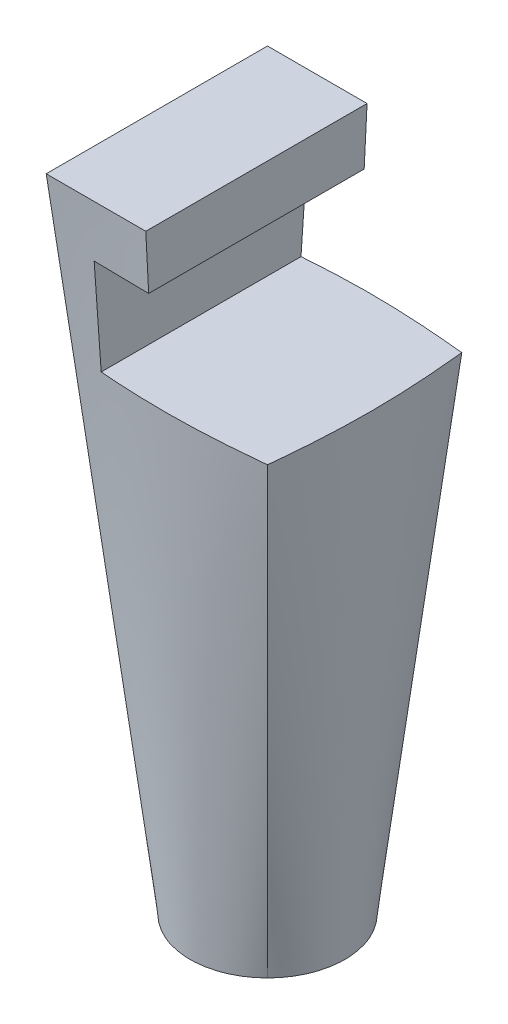
ISO-10303-21;
HEADER;
FILE_DESCRIPTION(('STEP AP214'),'2;1');
FILE_NAME('part.step','',(''),(''),'','','');
FILE_SCHEMA(('AUTOMOTIVE_DESIGN { 1 0 10303 214 1 1 1 1 }'));
ENDSEC;
DATA;
#1=APPLICATION_CONTEXT('core data for automotive mechanical design processes');
#2=APPLICATION_PROTOCOL_DEFINITION('international standard','automotive_design',2000,#1);
#3=PRODUCT_CONTEXT('',#1,'mechanical');
#4=PRODUCT('Part','Part','',(#3));
#5=PRODUCT_RELATED_PRODUCT_CATEGORY('part','',(#4));
#6=PRODUCT_DEFINITION_FORMATION('','',#4);
#7=PRODUCT_DEFINITION_CONTEXT('part definition',#1,'design');
#8=PRODUCT_DEFINITION('design','',#6,#7);
#9=PRODUCT_DEFINITION_SHAPE('','',#8);
#10=(LENGTH_UNIT() NAMED_UNIT(*) SI_UNIT(.MILLI.,.METRE.));
#11=(NAMED_UNIT(*) PLANE_ANGLE_UNIT() SI_UNIT($,.RADIAN.));
#12=(NAMED_UNIT(*) SI_UNIT($,.STERADIAN.) SOLID_ANGLE_UNIT());
#13=UNCERTAINTY_MEASURE_WITH_UNIT(LENGTH_MEASURE(1.E-05),#10,'distance_accuracy_value','');
#14=(GEOMETRIC_REPRESENTATION_CONTEXT(3) GLOBAL_UNCERTAINTY_ASSIGNED_CONTEXT((#13)) GLOBAL_UNIT_ASSIGNED_CONTEXT((#10,
#11,#12)) REPRESENTATION_CONTEXT('',''));
#15=CARTESIAN_POINT('',(0.,0.,0.));
#16=DIRECTION('',(0.,0.,1.));
#17=DIRECTION('',(1.,0.,0.));
#18=AXIS2_PLACEMENT_3D('',#15,#16,#17);
#19=CARTESIAN_POINT('',(1.23743686707646,0.,1.23743686707646));
#20=CARTESIAN_POINT('',(2.5,14.5,2.5));
#21=CARTESIAN_POINT('',(1.38327020040979,0.,1.09160353374312));
#22=CARTESIAN_POINT('',(2.5,14.5,2.08333333333333));
#23=CARTESIAN_POINT('',(1.5140275433683,0.,0.907689024252368));
#24=CARTESIAN_POINT('',(2.5,14.5,1.66666666666667));
#25=CARTESIAN_POINT('',(1.6980690296291,0.,0.48243169199438));
#26=CARTESIAN_POINT('',(2.5,14.5,0.833333333333335));
#27=CARTESIAN_POINT('',(1.75,0.,0.241624578050972));
#28=CARTESIAN_POINT('',(2.5,14.5,0.416666666666668));
#29=CARTESIAN_POINT('',(1.75,0.,-0.241624578050972));
#30=CARTESIAN_POINT('',(2.5,14.5,-0.416666666666665));
#31=CARTESIAN_POINT('',(1.6980690296291,0.,-0.48243169199438));
#32=CARTESIAN_POINT('',(2.5,14.5,-0.833333333333332));
#33=CARTESIAN_POINT('',(1.5140275433683,0.,-0.907689024252368));
#34=CARTESIAN_POINT('',(2.5,14.5,-1.66666666666667));
#35=CARTESIAN_POINT('',(1.38327020040979,0.,-1.09160353374312));
#36=CARTESIAN_POINT('',(2.5,14.5,-2.08333333333333));
#37=CARTESIAN_POINT('',(1.23743686707646,0.,-1.23743686707646));
#38=CARTESIAN_POINT('',(2.5,14.5,-2.5));
#39=B_SPLINE_SURFACE_WITH_KNOTS('',3,1,((#19,#20),(#21,#22),(#23,#24),(#25,#26),(#27,#28),(#29,
#30),(#31,#32),(#33,#34),(#35,#36),(#37,#38)),.UNSPECIFIED.,.F.,.F.,.F.,(4,2,2,2,4),(2,2),(0.,
0.25,0.5,0.75,1.),(0.,1.),.UNSPECIFIED.);
#40=DIRECTION('',(0.0864205644830598,0.992503386426897,-0.0864205644830599));
#41=VECTOR('',#40,1.);
#42=CARTESIAN_POINT('',(1.86871843353823,7.25,-1.86871843353823));
#43=LINE('',#42,#41);
#44=CARTESIAN_POINT('',(1.23743686707646,0.,-1.23743686707646));
#45=VERTEX_POINT('',#44);
#46=CARTESIAN_POINT('',(2.19524338170811,11.,-2.19524338170811));
#47=VERTEX_POINT('',#46);
#48=EDGE_CURVE('E269',#45,#47,#43,.T.);
#49=CARTESIAN_POINT('',(2.19524338170811,11.,-2.19524338170811));
#50=CARTESIAN_POINT('',(2.20908669909497,11.,-2.05713805914293));
#51=CARTESIAN_POINT('',(2.22222245093967,11.,-1.91895397142479));
#52=CARTESIAN_POINT('',(2.24654767861578,11.,-1.64239595817707));
#53=CARTESIAN_POINT('',(2.25773687618248,11.,-1.5040220083512));
#54=CARTESIAN_POINT('',(2.27763457422374,11.,-1.22707772693085));
#55=CARTESIAN_POINT('',(2.28634282946928,11.,-1.08850737728275));
#56=CARTESIAN_POINT('',(2.30080233108674,11.,-0.811217023945401));
#57=CARTESIAN_POINT('',(2.30655370646164,11.,-0.672497027049634));
#58=CARTESIAN_POINT('',(2.31495889274438,11.,-0.394944546318231));
#59=CARTESIAN_POINT('',(2.31761233016421,11.,-0.256112050938393));
#60=CARTESIAN_POINT('',(2.31950525578065,11.,0.0215761839970092));
#61=CARTESIAN_POINT('',(2.3187447710347,11.,0.160431923359628));
#62=CARTESIAN_POINT('',(2.3139502245108,11.,0.438075301175096));
#63=CARTESIAN_POINT('',(2.30991638389817,11.,0.576862943595041));
#64=CARTESIAN_POINT('',(2.29881179483826,11.,0.854324610481668));
#65=CARTESIAN_POINT('',(2.29174085030632,11.,0.992998627033032));
#66=CARTESIAN_POINT('',(2.27242387272641,11.,1.30916343650424));
#67=CARTESIAN_POINT('',(2.25928154831846,11.,1.48659817075888));
#68=CARTESIAN_POINT('',(2.22955679633143,11.,1.8411501939827));
#69=CARTESIAN_POINT('',(2.21297499985495,11.,2.0182675351846));
#70=CARTESIAN_POINT('',(2.19524338170811,11.,2.19524338170811));
#71=B_SPLINE_CURVE_WITH_KNOTS('',3,(#49,#50,#51,#52,#53,#54,#55,#56,#57,#58,#59,#60,#61,#62,#63,
#64,#65,#66,#67,#68,#69,#70),.UNSPECIFIED.,.F.,.F.,(4,2,2,2,2,2,2,2,2,2,4),(0.,
0.416402195183365,0.832863867255369,1.24936669025915,1.66585134050392,2.08238619703722,
2.49891775228112,2.91542116678366,3.3319514760569,3.86567285879153,4.39929639643508),.UNSPECIFIED.);
#72=CARTESIAN_POINT('',(2.19524338170811,11.,2.19524338170811));
#73=VERTEX_POINT('',#72);
#74=EDGE_CURVE('E84',#47,#73,#71,.T.);
#75=DIRECTION('',(0.0864205644830598,0.992503386426897,0.0864205644830598));
#76=VECTOR('',#75,1.);
#77=CARTESIAN_POINT('',(1.86871843353823,7.25,1.86871843353823));
#78=LINE('',#77,#76);
#79=CARTESIAN_POINT('',(1.23743686707646,0.,1.23743686707646));
#80=VERTEX_POINT('',#79);
#81=EDGE_CURVE('E264',#80,#73,#78,.T.);
#82=CARTESIAN_POINT('',(0.,0.,0.));
#83=DIRECTION('',(0.,1.,0.));
#84=DIRECTION('',(0.,0.,1.));
#85=AXIS2_PLACEMENT_3D('',#82,#83,#84);
#86=CIRCLE('',#85,1.75);
#87=EDGE_CURVE('E206',#80,#45,#86,.T.);
#88=ORIENTED_EDGE('',*,*,#48,.T.);
#89=ORIENTED_EDGE('',*,*,#74,.T.);
#90=ORIENTED_EDGE('',*,*,#81,.F.);
#91=ORIENTED_EDGE('',*,*,#87,.T.);
#92=EDGE_LOOP('',(#88,#89,#90,#91));
#93=FACE_BOUND('',#92,.T.);
#94=ADVANCED_FACE('F67',(#93),#39,.T.);
#95=CARTESIAN_POINT('',(0.,14.5,0.));
#96=DIRECTION('',(0.,-1.,0.));
#97=DIRECTION('',(0.,0.,-1.));
#98=AXIS2_PLACEMENT_3D('',#95,#96,#97);
#99=PLANE('',#98);
#100=DIRECTION('',(1.,0.,0.));
#101=VECTOR('',#100,1.);
#102=CARTESIAN_POINT('',(-2.5,14.5,2.5));
#103=LINE('',#102,#101);
#104=CARTESIAN_POINT('',(-2.5,14.5,2.5));
#105=VERTEX_POINT('',#104);
#106=CARTESIAN_POINT('',(-0.250000000000002,14.5,2.5));
#107=VERTEX_POINT('',#106);
#108=EDGE_CURVE('E368',#105,#107,#103,.T.);
#109=ORIENTED_EDGE('',*,*,#108,.T.);
#110=DIRECTION('',(0.,0.,-1.));
#111=VECTOR('',#110,1.);
#112=CARTESIAN_POINT('',(-0.250000000000002,14.5,0.));
#113=LINE('',#112,#111);
#114=CARTESIAN_POINT('',(-0.250000000000002,14.5,-2.5));
#115=VERTEX_POINT('',#114);
#116=EDGE_CURVE('E342',#107,#115,#113,.T.);
#117=ORIENTED_EDGE('',*,*,#116,.T.);
#118=DIRECTION('',(-1.,0.,0.));
#119=VECTOR('',#118,1.);
#120=CARTESIAN_POINT('',(-2.5,14.5,-2.5));
#121=LINE('',#120,#119);
#122=CARTESIAN_POINT('',(-2.5,14.5,-2.5));
#123=VERTEX_POINT('',#122);
#124=EDGE_CURVE('E379',#115,#123,#121,.T.);
#125=ORIENTED_EDGE('',*,*,#124,.T.);
#126=DIRECTION('',(0.,0.,1.));
#127=VECTOR('',#126,1.);
#128=CARTESIAN_POINT('',(-2.5,14.5,2.5));
#129=LINE('',#128,#127);
#130=EDGE_CURVE('E359',#123,#105,#129,.T.);
#131=ORIENTED_EDGE('',*,*,#130,.T.);
#132=EDGE_LOOP('',(#109,#117,#125,#131));
#133=FACE_BOUND('',#132,.T.);
#134=ADVANCED_FACE('F147',(#133),#99,.F.);
#135=CARTESIAN_POINT('',(0.,0.,0.));
#136=DIRECTION('',(0.,1.,0.));
#137=DIRECTION('',(0.,0.,1.));
#138=AXIS2_PLACEMENT_3D('',#135,#136,#137);
#139=PLANE('',#138);
#140=CARTESIAN_POINT('',(0.,0.,0.));
#141=DIRECTION('',(0.,-1.,0.));
#142=DIRECTION('',(0.,0.,-1.));
#143=AXIS2_PLACEMENT_3D('',#140,#141,#142);
#144=CIRCLE('',#143,1.);
#145=CARTESIAN_POINT('',(0.,0.,-1.));
#146=VERTEX_POINT('',#145);
#147=EDGE_CURVE('E510',#146,#146,#144,.T.);
#148=ORIENTED_EDGE('',*,*,#147,.F.);
#149=EDGE_LOOP('',(#148));
#150=FACE_BOUND('',#149,.T.);
#151=CARTESIAN_POINT('',(-1.23743686707646,0.,-1.23743686707646));
#152=VERTEX_POINT('',#151);
#153=EDGE_CURVE('E202',#45,#152,#86,.T.);
#154=ORIENTED_EDGE('',*,*,#153,.F.);
#155=ORIENTED_EDGE('',*,*,#87,.F.);
#156=CARTESIAN_POINT('',(-1.23743686707646,0.,1.23743686707646));
#157=VERTEX_POINT('',#156);
#158=EDGE_CURVE('E236',#157,#80,#86,.T.);
#159=ORIENTED_EDGE('',*,*,#158,.F.);
#160=EDGE_CURVE('E243',#152,#157,#86,.T.);
#161=ORIENTED_EDGE('',*,*,#160,.F.);
#162=EDGE_LOOP('',(#154,#155,#159,#161));
#163=FACE_BOUND('',#162,.T.);
#164=ADVANCED_FACE('F153',(#150,#163),#139,.F.);
#165=CARTESIAN_POINT('',(-1.23743686707646,0.,1.23743686707646));
#166=CARTESIAN_POINT('',(-2.5,14.5,2.5));
#167=CARTESIAN_POINT('',(-1.09160353374313,0.,1.38327020040979));
#168=CARTESIAN_POINT('',(-2.08333333333333,14.5,2.5));
#169=CARTESIAN_POINT('',(-0.907689024252368,0.,1.5140275433683));
#170=CARTESIAN_POINT('',(-1.66666666666667,14.5,2.5));
#171=CARTESIAN_POINT('',(-0.48243169199438,0.,1.6980690296291));
#172=CARTESIAN_POINT('',(-0.833333333333335,14.5,2.5));
#173=CARTESIAN_POINT('',(-0.241624578050972,0.,1.75));
#174=CARTESIAN_POINT('',(-0.416666666666668,14.5,2.5));
#175=CARTESIAN_POINT('',(0.241624578050972,0.,1.75));
#176=CARTESIAN_POINT('',(0.416666666666665,14.5,2.5));
#177=CARTESIAN_POINT('',(0.48243169199438,0.,1.6980690296291));
#178=CARTESIAN_POINT('',(0.833333333333332,14.5,2.5));
#179=CARTESIAN_POINT('',(0.907689024252368,0.,1.5140275433683));
#180=CARTESIAN_POINT('',(1.66666666666667,14.5,2.5));
#181=CARTESIAN_POINT('',(1.09160353374312,0.,1.38327020040979));
#182=CARTESIAN_POINT('',(2.08333333333333,14.5,2.5));
#183=CARTESIAN_POINT('',(1.23743686707646,0.,1.23743686707646));
#184=CARTESIAN_POINT('',(2.5,14.5,2.5));
#185=B_SPLINE_SURFACE_WITH_KNOTS('',3,1,((#165,#166),(#167,#168),(#169,#170),(#171,#172),(#173,
#174),(#175,#176),(#177,#178),(#179,#180),(#181,#182),(#183,#184)),.UNSPECIFIED.,.F.,.F.,.F.,(4,
2,2,2,4),(2,2),(0.,0.25,0.5,0.75,1.),(0.,1.),.UNSPECIFIED.);
#186=CARTESIAN_POINT('',(-0.250000000000002,14.5,2.5));
#187=CARTESIAN_POINT('',(-0.250000000000002,14.0833333333333,2.47825848808289));
#188=CARTESIAN_POINT('',(-0.250000000000002,13.6666666666667,2.45651697616578));
#189=CARTESIAN_POINT('',(-0.250000000000002,13.25,2.43477546424868));
#190=B_SPLINE_CURVE_WITH_KNOTS('',3,(#186,#187,#188,#189),.UNSPECIFIED.,.F.,.F.,(4,4),(0.,
1.25170053929204),.UNSPECIFIED.);
#191=CARTESIAN_POINT('',(-0.250000000000002,13.25,2.43477546424868));
#192=VERTEX_POINT('',#191);
#193=EDGE_CURVE('E349',#107,#192,#190,.T.);
#194=DIRECTION('',(0.0864205644830598,-0.992503386426897,-0.0864205644830599));
#195=VECTOR('',#194,1.);
#196=CARTESIAN_POINT('',(-1.86871843353823,7.25,1.86871843353823));
#197=LINE('',#196,#195);
#198=EDGE_CURVE('E260',#105,#157,#197,.T.);
#199=CARTESIAN_POINT('',(2.19524338170811,11.,2.19524338170811));
#200=CARTESIAN_POINT('',(2.05714062740062,11.,2.20908645636206));
#201=CARTESIAN_POINT('',(1.91895912624078,11.,2.22222196828403));
#202=CARTESIAN_POINT('',(1.6424011296015,11.,2.24654725295406));
#203=CARTESIAN_POINT('',(1.50402460347413,11.,2.25773667469404));
#204=CARTESIAN_POINT('',(1.22707553548212,11.,2.27763474671072));
#205=CARTESIAN_POINT('',(1.08850297609326,11.,2.28634315899416));
#206=CARTESIAN_POINT('',(0.811212689429494,11.,2.3008024563481));
#207=CARTESIAN_POINT('',(0.67249497384352,11.,2.30655356357371));
#208=CARTESIAN_POINT('',(0.394949413050781,11.,2.31495895045021));
#209=CARTESIAN_POINT('',(0.256121558195651,11.,2.31761291951141));
#210=CARTESIAN_POINT('',(-0.0215656838866123,11.,2.31950452718972));
#211=CARTESIAN_POINT('',(-0.160425072564837,11.,2.31874194673873));
#212=CARTESIAN_POINT('',(-0.499622739488253,11.,2.31289162562836));
#213=CARTESIAN_POINT('',(-0.699932691427977,11.,2.30603675633119));
#214=CARTESIAN_POINT('',(-1.00015480866609,11.,2.29113529319527));
#215=CARTESIAN_POINT('',(-1.10019024449348,11.,2.2853981287319));
#216=CARTESIAN_POINT('',(-1.30016655323596,11.,2.27252952204055));
#217=CARTESIAN_POINT('',(-1.4001074307605,11.,2.26539815171218));
#218=CARTESIAN_POINT('',(-1.5,11.,2.25764211899687));
#219=B_SPLINE_CURVE_WITH_KNOTS('',3,(#199,#200,#201,#202,#203,#204,#205,#206,#207,#208,#209,
#210,#211,#212,#213,#214,#215,#216,#217,#218),.UNSPECIFIED.,.F.,.F.,(4,2,2,2,2,2,2,2,2,4),(0.,
0.41639442079427,0.832863867184912,1.24937325037487,1.66585134047589,2.08237119257644,
2.49891775218164,3.1000787108763,3.40067041331482,3.70124661823836),.UNSPECIFIED.);
#220=CARTESIAN_POINT('',(-1.5,11.,2.25764211899687));
#221=VERTEX_POINT('',#220);
#222=EDGE_CURVE('E497',#73,#221,#219,.T.);
#223=CARTESIAN_POINT('',(-1.5,11.,2.25764211899687));
#224=CARTESIAN_POINT('',(-1.5,11.1874621848679,2.2714043543781));
#225=CARTESIAN_POINT('',(-1.5,11.3749352531887,2.28501780898525));
#226=CARTESIAN_POINT('',(-1.5,11.7499006919538,2.31197162401861));
#227=CARTESIAN_POINT('',(-1.5,11.9373930623633,2.32531198492998));
#228=CARTESIAN_POINT('',(-1.5,12.3123952916166,2.35174412760684));
#229=CARTESIAN_POINT('',(-1.5,12.499905150459,2.36483590939226));
#230=CARTESIAN_POINT('',(-1.5,12.8749409928892,2.39079138045397));
#231=CARTESIAN_POINT('',(-1.5,13.0624669765052,2.40365506932498));
#232=CARTESIAN_POINT('',(-1.5,13.25,2.41641493130211));
#233=B_SPLINE_CURVE_WITH_KNOTS('',3,(#223,#224,#225,#226,#227,#228,#229,#230,#231,#232),
.UNSPECIFIED.,.F.,.F.,(4,2,2,2,4),(0.,0.56389990149865,1.12779880113771,1.69169765555649,
2.25559751183493),.UNSPECIFIED.);
#234=CARTESIAN_POINT('',(-1.5,13.25,2.41641493130211));
#235=VERTEX_POINT('',#234);
#236=EDGE_CURVE('E132',#221,#235,#233,.T.);
#237=CARTESIAN_POINT('',(-0.250000000000002,13.25,2.43477546424868));
#238=CARTESIAN_POINT('',(-0.354179849194415,13.25,2.43430335227224));
#239=CARTESIAN_POINT('',(-0.458358256798431,13.25,2.43354590379475));
#240=CARTESIAN_POINT('',(-0.666707287267045,13.25,2.43148948030518));
#241=CARTESIAN_POINT('',(-0.770877910257511,13.25,2.43019051810601));
#242=CARTESIAN_POINT('',(-0.979211308840503,13.25,2.42708018990412));
#243=CARTESIAN_POINT('',(-1.08337408443981,13.25,2.42526882434956));
#244=CARTESIAN_POINT('',(-1.29169298567726,13.25,2.42117993076744));
#245=CARTESIAN_POINT('',(-1.39584911109974,13.25,2.41890239171124));
#246=CARTESIAN_POINT('',(-1.5,13.25,2.41641493130211));
#247=B_SPLINE_CURVE_WITH_KNOTS('',3,(#237,#238,#239,#240,#241,#242,#243,#244,#245,#246),
.UNSPECIFIED.,.F.,.F.,(4,2,2,2,4),(0.,0.312542159578096,0.625076924434453,0.937611415949211,
1.25015330219218),.UNSPECIFIED.);
#248=EDGE_CURVE('E335',#192,#235,#247,.T.);
#249=ORIENTED_EDGE('',*,*,#193,.F.);
#250=ORIENTED_EDGE('',*,*,#108,.F.);
#251=ORIENTED_EDGE('',*,*,#198,.T.);
#252=ORIENTED_EDGE('',*,*,#158,.T.);
#253=ORIENTED_EDGE('',*,*,#81,.T.);
#254=ORIENTED_EDGE('',*,*,#222,.T.);
#255=ORIENTED_EDGE('',*,*,#236,.T.);
#256=ORIENTED_EDGE('',*,*,#248,.F.);
#257=EDGE_LOOP('',(#249,#250,#251,#252,#253,#254,#255,#256));
#258=FACE_BOUND('',#257,.T.);
#259=ADVANCED_FACE('F161',(#258),#185,.T.);
#260=CARTESIAN_POINT('',(-1.23743686707646,0.,-1.23743686707646));
#261=CARTESIAN_POINT('',(-2.5,14.5,-2.5));
#262=CARTESIAN_POINT('',(-1.38327020040979,0.,-1.09160353374313));
#263=CARTESIAN_POINT('',(-2.5,14.5,-2.08333333333333));
#264=CARTESIAN_POINT('',(-1.5140275433683,0.,-0.907689024252368));
#265=CARTESIAN_POINT('',(-2.5,14.5,-1.66666666666667));
#266=CARTESIAN_POINT('',(-1.6980690296291,0.,-0.482431691994381));
#267=CARTESIAN_POINT('',(-2.5,14.5,-0.833333333333335));
#268=CARTESIAN_POINT('',(-1.75,0.,-0.241624578050972));
#269=CARTESIAN_POINT('',(-2.5,14.5,-0.416666666666668));
#270=CARTESIAN_POINT('',(-1.75,0.,0.241624578050972));
#271=CARTESIAN_POINT('',(-2.5,14.5,0.416666666666665));
#272=CARTESIAN_POINT('',(-1.6980690296291,0.,0.48243169199438));
#273=CARTESIAN_POINT('',(-2.5,14.5,0.833333333333332));
#274=CARTESIAN_POINT('',(-1.5140275433683,0.,0.907689024252367));
#275=CARTESIAN_POINT('',(-2.5,14.5,1.66666666666667));
#276=CARTESIAN_POINT('',(-1.38327020040979,0.,1.09160353374312));
#277=CARTESIAN_POINT('',(-2.5,14.5,2.08333333333333));
#278=CARTESIAN_POINT('',(-1.23743686707646,0.,1.23743686707646));
#279=CARTESIAN_POINT('',(-2.5,14.5,2.5));
#280=B_SPLINE_SURFACE_WITH_KNOTS('',3,1,((#260,#261),(#262,#263),(#264,#265),(#266,#267),(#268,
#269),(#270,#271),(#272,#273),(#274,#275),(#276,#277),(#278,#279)),.UNSPECIFIED.,.F.,.F.,.F.,(4,
2,2,2,4),(2,2),(0.,0.25,0.5,0.75,1.),(0.,1.),.UNSPECIFIED.);
#281=DIRECTION('',(-0.0864205644830599,0.992503386426897,-0.0864205644830598));
#282=VECTOR('',#281,1.);
#283=CARTESIAN_POINT('',(-1.86871843353823,7.25,-1.86871843353823));
#284=LINE('',#283,#282);
#285=EDGE_CURVE('E358',#152,#123,#284,.T.);
#286=ORIENTED_EDGE('',*,*,#160,.T.);
#287=ORIENTED_EDGE('',*,*,#198,.F.);
#288=ORIENTED_EDGE('',*,*,#130,.F.);
#289=ORIENTED_EDGE('',*,*,#285,.F.);
#290=EDGE_LOOP('',(#286,#287,#288,#289));
#291=FACE_BOUND('',#290,.T.);
#292=ADVANCED_FACE('F166',(#291),#280,.T.);
#293=CARTESIAN_POINT('',(1.23743686707646,0.,-1.23743686707646));
#294=CARTESIAN_POINT('',(2.5,14.5,-2.5));
#295=CARTESIAN_POINT('',(1.09160353374313,0.,-1.38327020040979));
#296=CARTESIAN_POINT('',(2.08333333333333,14.5,-2.5));
#297=CARTESIAN_POINT('',(0.907689024252368,0.,-1.5140275433683));
#298=CARTESIAN_POINT('',(1.66666666666667,14.5,-2.5));
#299=CARTESIAN_POINT('',(0.48243169199438,0.,-1.6980690296291));
#300=CARTESIAN_POINT('',(0.833333333333335,14.5,-2.5));
#301=CARTESIAN_POINT('',(0.241624578050972,0.,-1.75));
#302=CARTESIAN_POINT('',(0.416666666666668,14.5,-2.5));
#303=CARTESIAN_POINT('',(-0.241624578050972,0.,-1.75));
#304=CARTESIAN_POINT('',(-0.416666666666665,14.5,-2.5));
#305=CARTESIAN_POINT('',(-0.48243169199438,0.,-1.6980690296291));
#306=CARTESIAN_POINT('',(-0.833333333333332,14.5,-2.5));
#307=CARTESIAN_POINT('',(-0.907689024252368,0.,-1.5140275433683));
#308=CARTESIAN_POINT('',(-1.66666666666667,14.5,-2.5));
#309=CARTESIAN_POINT('',(-1.09160353374312,0.,-1.38327020040979));
#310=CARTESIAN_POINT('',(-2.08333333333333,14.5,-2.5));
#311=CARTESIAN_POINT('',(-1.23743686707646,0.,-1.23743686707646));
#312=CARTESIAN_POINT('',(-2.5,14.5,-2.5));
#313=B_SPLINE_SURFACE_WITH_KNOTS('',3,1,((#293,#294),(#295,#296),(#297,#298),(#299,#300),(#301,
#302),(#303,#304),(#305,#306),(#307,#308),(#309,#310),(#311,#312)),.UNSPECIFIED.,.F.,.F.,.F.,(4,
2,2,2,4),(2,2),(0.,0.25,0.5,0.75,1.),(0.,1.),.UNSPECIFIED.);
#314=CARTESIAN_POINT('',(-0.250000000000002,13.25,-2.43477546424868));
#315=CARTESIAN_POINT('',(-0.250000000000002,13.6666666666667,-2.45651697616578));
#316=CARTESIAN_POINT('',(-0.250000000000002,14.0833333333333,-2.47825848808289));
#317=CARTESIAN_POINT('',(-0.250000000000002,14.5,-2.5));
#318=B_SPLINE_CURVE_WITH_KNOTS('',3,(#314,#315,#316,#317),.UNSPECIFIED.,.F.,.F.,(4,4),(0.,
1.25170053929204),.UNSPECIFIED.);
#319=CARTESIAN_POINT('',(-0.250000000000002,13.25,-2.43477546424868));
#320=VERTEX_POINT('',#319);
#321=EDGE_CURVE('E77',#320,#115,#318,.T.);
#322=CARTESIAN_POINT('',(-1.5,13.25,-2.41641493130211));
#323=CARTESIAN_POINT('',(-1.39584911109974,13.25,-2.41890239171124));
#324=CARTESIAN_POINT('',(-1.29169298567726,13.25,-2.42117993076744));
#325=CARTESIAN_POINT('',(-1.08337408443981,13.25,-2.42526882434956));
#326=CARTESIAN_POINT('',(-0.979211308840503,13.25,-2.42708018990412));
#327=CARTESIAN_POINT('',(-0.770877910257511,13.25,-2.43019051810601));
#328=CARTESIAN_POINT('',(-0.666707287267045,13.25,-2.43148948030518));
#329=CARTESIAN_POINT('',(-0.458358256798431,13.25,-2.43354590379475));
#330=CARTESIAN_POINT('',(-0.354179849194415,13.25,-2.43430335227224));
#331=CARTESIAN_POINT('',(-0.250000000000002,13.25,-2.43477546424868));
#332=B_SPLINE_CURVE_WITH_KNOTS('',3,(#322,#323,#324,#325,#326,#327,#328,#329,#330,#331),
.UNSPECIFIED.,.F.,.F.,(4,2,2,2,4),(0.,0.312541886242965,0.625076377757723,0.93761114261408,
1.25015330219218),.UNSPECIFIED.);
#333=CARTESIAN_POINT('',(-1.5,13.25,-2.41641493130211));
#334=VERTEX_POINT('',#333);
#335=EDGE_CURVE('E321',#334,#320,#332,.T.);
#336=CARTESIAN_POINT('',(-1.5,13.25,-2.41641493130211));
#337=CARTESIAN_POINT('',(-1.5,13.0624669765052,-2.40365506932498));
#338=CARTESIAN_POINT('',(-1.5,12.8749409928892,-2.39079138045397));
#339=CARTESIAN_POINT('',(-1.5,12.499905150459,-2.36483590939226));
#340=CARTESIAN_POINT('',(-1.5,12.3123952916166,-2.35174412760684));
#341=CARTESIAN_POINT('',(-1.5,11.9373930623633,-2.32531198492998));
#342=CARTESIAN_POINT('',(-1.50000000000001,11.7499006919538,-2.31197162401861));
#343=CARTESIAN_POINT('',(-1.5,11.3749352531887,-2.28501780898525));
#344=CARTESIAN_POINT('',(-1.49999999999999,11.1874621848679,-2.2714043543781));
#345=CARTESIAN_POINT('',(-1.49999999999996,11.,-2.25764211899687));
#346=B_SPLINE_CURVE_WITH_KNOTS('',3,(#336,#337,#338,#339,#340,#341,#342,#343,#344,#345),
.UNSPECIFIED.,.F.,.F.,(4,2,2,2,4),(0.,0.563899856278444,1.12779871069722,1.69169761033628,
2.25559751183493),.UNSPECIFIED.);
#347=CARTESIAN_POINT('',(-1.5,11.,-2.25764211899687));
#348=VERTEX_POINT('',#347);
#349=EDGE_CURVE('E314',#334,#348,#346,.T.);
#350=CARTESIAN_POINT('',(-1.5,11.,-2.25764211899687));
#351=CARTESIAN_POINT('',(-1.43079726910189,11.,-2.2630000697578));
#352=CARTESIAN_POINT('',(-1.36157235893598,11.,-2.26807532308544));
#353=CARTESIAN_POINT('',(-1.22307790899897,11.,-2.27758608914436));
#354=CARTESIAN_POINT('',(-1.15380836871673,11.,-2.28202159441303));
#355=CARTESIAN_POINT('',(-0.945918696287036,11.,-2.29425773696841));
#356=CARTESIAN_POINT('',(-0.807233614555825,11.,-2.30098671969858));
#357=CARTESIAN_POINT('',(-0.529736570264594,11.,-2.31139069678446));
#358=CARTESIAN_POINT('',(-0.39092459893159,11.,-2.3150654609864));
#359=CARTESIAN_POINT('',(-0.182677475599708,11.,-2.31812044838563));
#360=CARTESIAN_POINT('',(-0.113259035888562,11.,-2.31872927003463));
#361=CARTESIAN_POINT('',(0.0255810378520693,11.,-2.31908753313481));
#362=CARTESIAN_POINT('',(0.0950026719119317,11.,-2.31883696304557));
#363=CARTESIAN_POINT('',(0.30325541781844,11.,-2.31683125478801));
#364=CARTESIAN_POINT('',(0.442075802224211,11.,-2.31382213927927));
#365=CARTESIAN_POINT('',(0.719615734077507,11.,-2.30471734122607));
#366=CARTESIAN_POINT('',(0.858335279478661,11.,-2.29862159770302));
#367=CARTESIAN_POINT('',(1.19706393230569,11.,-2.2801522189474));
#368=CARTESIAN_POINT('',(1.39698466246538,11.,-2.26619353290216));
#369=CARTESIAN_POINT('',(1.79641577983731,11.,-2.23373544284296));
#370=CARTESIAN_POINT('',(1.99592625241752,11.,-2.21523710635226));
#371=CARTESIAN_POINT('',(2.19524338170811,11.,-2.19524338170811));
#372=B_SPLINE_CURVE_WITH_KNOTS('',3,(#350,#351,#352,#353,#354,#355,#356,#357,#358,#359,#360,
#361,#362,#363,#364,#365,#366,#367,#368,#369,#370,#371),.UNSPECIFIED.,.F.,.F.,(4,2,2,2,2,2,2,2,
2,2,4),(0.,0.208229139604714,0.416460707987226,0.832972294483395,1.24951526479268,
1.45777397808426,1.66603548800513,2.08255422208236,2.49908118511299,3.10023823853712,
3.70125406187343),.UNSPECIFIED.);
#373=EDGE_CURVE('E308',#348,#47,#372,.T.);
#374=ORIENTED_EDGE('',*,*,#321,.F.);
#375=ORIENTED_EDGE('',*,*,#335,.F.);
#376=ORIENTED_EDGE('',*,*,#349,.T.);
#377=ORIENTED_EDGE('',*,*,#373,.T.);
#378=ORIENTED_EDGE('',*,*,#48,.F.);
#379=ORIENTED_EDGE('',*,*,#153,.T.);
#380=ORIENTED_EDGE('',*,*,#285,.T.);
#381=ORIENTED_EDGE('',*,*,#124,.F.);
#382=EDGE_LOOP('',(#374,#375,#376,#377,#378,#379,#380,#381));
#383=FACE_BOUND('',#382,.T.);
#384=ADVANCED_FACE('F282',(#383),#313,.T.);
#385=CARTESIAN_POINT('',(-0.250000000000002,0.,10.));
#386=DIRECTION('',(-1.,0.,0.));
#387=DIRECTION('',(0.,0.,1.));
#388=AXIS2_PLACEMENT_3D('',#385,#386,#387);
#389=PLANE('',#388);
#390=ORIENTED_EDGE('',*,*,#193,.T.);
#391=DIRECTION('',(0.,0.,-1.));
#392=VECTOR('',#391,1.);
#393=CARTESIAN_POINT('',(-0.250000000000002,13.25,10.));
#394=LINE('',#393,#392);
#395=EDGE_CURVE('E503',#192,#320,#394,.T.);
#396=ORIENTED_EDGE('',*,*,#395,.T.);
#397=ORIENTED_EDGE('',*,*,#321,.T.);
#398=ORIENTED_EDGE('',*,*,#116,.F.);
#399=EDGE_LOOP('',(#390,#396,#397,#398));
#400=FACE_BOUND('',#399,.T.);
#401=ADVANCED_FACE('F218',(#400),#389,.F.);
#402=CARTESIAN_POINT('',(0.,13.25,10.));
#403=DIRECTION('',(0.,1.,0.));
#404=DIRECTION('',(0.,0.,1.));
#405=AXIS2_PLACEMENT_3D('',#402,#403,#404);
#406=PLANE('',#405);
#407=ORIENTED_EDGE('',*,*,#248,.T.);
#408=DIRECTION('',(0.,0.,-1.));
#409=VECTOR('',#408,1.);
#410=CARTESIAN_POINT('',(-1.5,13.25,10.));
#411=LINE('',#410,#409);
#412=EDGE_CURVE('E504',#235,#334,#411,.T.);
#413=ORIENTED_EDGE('',*,*,#412,.T.);
#414=ORIENTED_EDGE('',*,*,#335,.T.);
#415=ORIENTED_EDGE('',*,*,#395,.F.);
#416=EDGE_LOOP('',(#407,#413,#414,#415));
#417=FACE_BOUND('',#416,.T.);
#418=ADVANCED_FACE('F327',(#417),#406,.F.);
#419=CARTESIAN_POINT('',(-1.5,0.,10.));
#420=DIRECTION('',(1.,0.,0.));
#421=DIRECTION('',(0.,1.,0.));
#422=AXIS2_PLACEMENT_3D('',#419,#420,#421);
#423=PLANE('',#422);
#424=DIRECTION('',(0.,0.,-1.));
#425=VECTOR('',#424,1.);
#426=CARTESIAN_POINT('',(-1.5,11.,10.));
#427=LINE('',#426,#425);
#428=EDGE_CURVE('E506',#221,#348,#427,.T.);
#429=ORIENTED_EDGE('',*,*,#428,.T.);
#430=ORIENTED_EDGE('',*,*,#349,.F.);
#431=ORIENTED_EDGE('',*,*,#412,.F.);
#432=ORIENTED_EDGE('',*,*,#236,.F.);
#433=EDGE_LOOP('',(#429,#430,#431,#432));
#434=FACE_BOUND('',#433,.T.);
#435=ADVANCED_FACE('F330',(#434),#423,.T.);
#436=CARTESIAN_POINT('',(0.,11.,10.));
#437=DIRECTION('',(0.,1.,0.));
#438=DIRECTION('',(0.,0.,1.));
#439=AXIS2_PLACEMENT_3D('',#436,#437,#438);
#440=PLANE('',#439);
#441=ORIENTED_EDGE('',*,*,#74,.F.);
#442=ORIENTED_EDGE('',*,*,#373,.F.);
#443=ORIENTED_EDGE('',*,*,#428,.F.);
#444=ORIENTED_EDGE('',*,*,#222,.F.);
#445=EDGE_LOOP('',(#441,#442,#443,#444));
#446=FACE_BOUND('',#445,.T.);
#447=ADVANCED_FACE('F142',(#446),#440,.T.);
#448=CARTESIAN_POINT('',(0.,8.,0.));
#449=DIRECTION('',(0.,-1.,0.));
#450=DIRECTION('',(0.,0.,-1.));
#451=AXIS2_PLACEMENT_3D('',#448,#449,#450);
#452=CYLINDRICAL_SURFACE('',#451,1.);
#453=CARTESIAN_POINT('',(0.,7.,0.));
#454=DIRECTION('',(0.,-1.,0.));
#455=DIRECTION('',(0.,0.,-1.));
#456=AXIS2_PLACEMENT_3D('',#453,#454,#455);
#457=CIRCLE('',#456,1.);
#458=CARTESIAN_POINT('',(0.,7.,-1.));
#459=VERTEX_POINT('',#458);
#460=EDGE_CURVE('E12',#459,#459,#457,.F.);
#461=ORIENTED_EDGE('',*,*,#460,.T.);
#462=EDGE_LOOP('',(#461));
#463=FACE_BOUND('',#462,.T.);
#464=ORIENTED_EDGE('',*,*,#147,.T.);
#465=EDGE_LOOP('',(#464));
#466=FACE_BOUND('',#465,.T.);
#467=ADVANCED_FACE('F137',(#463,#466),#452,.F.);
#468=CARTESIAN_POINT('',(0.,7.,0.));
#469=DIRECTION('',(0.,-1.,0.));
#470=DIRECTION('',(0.,0.,-1.));
#471=AXIS2_PLACEMENT_3D('',#468,#469,#470);
#472=CONICAL_SURFACE('',#471,1.00000000000001,0.785398163397453);
#473=ORIENTED_EDGE('',*,*,#460,.F.);
#474=EDGE_LOOP('',(#473));
#475=FACE_BOUND('',#474,.T.);
#476=CARTESIAN_POINT('',(0.,8.,0.));
#477=VERTEX_POINT('',#476);
#478=VERTEX_LOOP('',#477);
#479=FACE_BOUND('',#478,.T.);
#480=ADVANCED_FACE('F70',(#475,#479),#472,.F.);
#481=CLOSED_SHELL('',(#94,#134,#164,#259,#292,#384,#401,#418,#435,#447,#467,#480));
#482=MANIFOLD_SOLID_BREP('B2',#481);
#483=ADVANCED_BREP_SHAPE_REPRESENTATION('',(#18,#482),#14);
#484=SHAPE_DEFINITION_REPRESENTATION(#9,#483);
ENDSEC;
END-ISO-10303-21;
